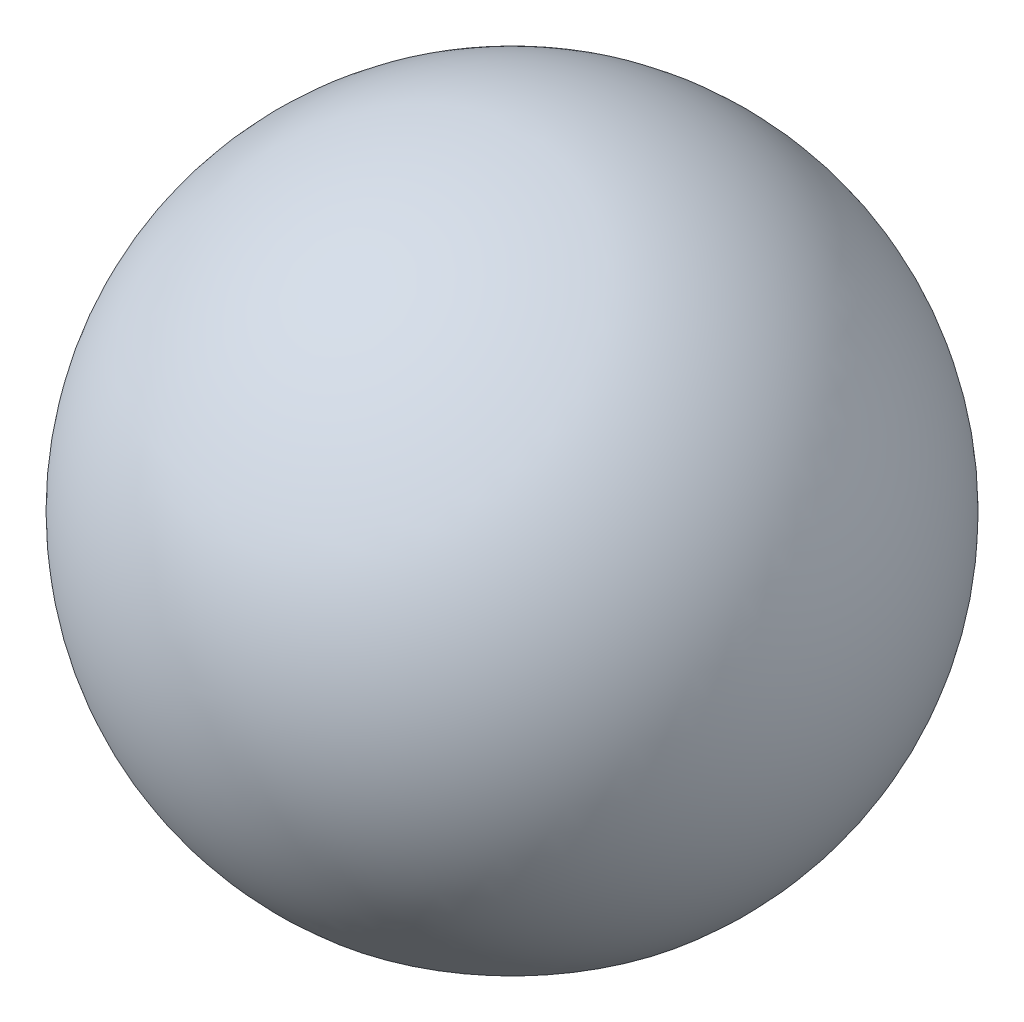
ISO-10303-21;
HEADER;
FILE_DESCRIPTION(('STEP AP214'),'2;1');
FILE_NAME('part.step','',(''),(''),'','','');
FILE_SCHEMA(('AUTOMOTIVE_DESIGN { 1 0 10303 214 1 1 1 1 }'));
ENDSEC;
DATA;
#1=APPLICATION_CONTEXT('core data for automotive mechanical design processes');
#2=APPLICATION_PROTOCOL_DEFINITION('international standard','automotive_design',2000,#1);
#3=PRODUCT_CONTEXT('',#1,'mechanical');
#4=PRODUCT('Part','Part','',(#3));
#5=PRODUCT_RELATED_PRODUCT_CATEGORY('part','',(#4));
#6=PRODUCT_DEFINITION_FORMATION('','',#4);
#7=PRODUCT_DEFINITION_CONTEXT('part definition',#1,'design');
#8=PRODUCT_DEFINITION('design','',#6,#7);
#9=PRODUCT_DEFINITION_SHAPE('','',#8);
#10=(LENGTH_UNIT() NAMED_UNIT(*) SI_UNIT(.MILLI.,.METRE.));
#11=(NAMED_UNIT(*) PLANE_ANGLE_UNIT() SI_UNIT($,.RADIAN.));
#12=(NAMED_UNIT(*) SI_UNIT($,.STERADIAN.) SOLID_ANGLE_UNIT());
#13=UNCERTAINTY_MEASURE_WITH_UNIT(LENGTH_MEASURE(1.E-05),#10,'distance_accuracy_value','');
#14=(GEOMETRIC_REPRESENTATION_CONTEXT(3) GLOBAL_UNCERTAINTY_ASSIGNED_CONTEXT((#13)) GLOBAL_UNIT_ASSIGNED_CONTEXT((#10,
#11,#12)) REPRESENTATION_CONTEXT('',''));
#15=CARTESIAN_POINT('',(0.,0.,0.));
#16=DIRECTION('',(0.,0.,1.));
#17=DIRECTION('',(1.,0.,0.));
#18=AXIS2_PLACEMENT_3D('',#15,#16,#17);
#19=CARTESIAN_POINT('',(-5.2,10.,0.));
#20=DIRECTION('',(-1.,0.,0.));
#21=DIRECTION('',(0.,0.,1.));
#22=AXIS2_PLACEMENT_3D('',#19,#20,#21);
#23=PLANE('',#22);
#24=DIRECTION('',(0.,-1.,0.));
#25=VECTOR('',#24,1.);
#26=CARTESIAN_POINT('',(-5.2,10.,3.95));
#27=LINE('',#26,#25);
#28=CARTESIAN_POINT('',(-5.2,10.,3.95));
#29=VERTEX_POINT('',#28);
#30=CARTESIAN_POINT('',(-5.2,3.,3.95));
#31=VERTEX_POINT('',#30);
#32=EDGE_CURVE('E50',#29,#31,#27,.T.);
#33=ORIENTED_EDGE('',*,*,#32,.T.);
#34=DIRECTION('',(0.,0.,-1.));
#35=VECTOR('',#34,1.);
#36=CARTESIAN_POINT('',(-5.2,3.,0.));
#37=LINE('',#36,#35);
#38=CARTESIAN_POINT('',(-5.2,3.,-3.95));
#39=VERTEX_POINT('',#38);
#40=EDGE_CURVE('E82',#31,#39,#37,.T.);
#41=ORIENTED_EDGE('',*,*,#40,.T.);
#42=DIRECTION('',(0.,-1.,0.));
#43=VECTOR('',#42,1.);
#44=CARTESIAN_POINT('',(-5.2,10.,-3.95));
#45=LINE('',#44,#43);
#46=CARTESIAN_POINT('',(-5.2,10.,-3.95));
#47=VERTEX_POINT('',#46);
#48=EDGE_CURVE('E64',#47,#39,#45,.T.);
#49=ORIENTED_EDGE('',*,*,#48,.F.);
#50=DIRECTION('',(0.,0.,-1.));
#51=VECTOR('',#50,1.);
#52=CARTESIAN_POINT('',(-5.2,10.,0.));
#53=LINE('',#52,#51);
#54=EDGE_CURVE('E122',#29,#47,#53,.T.);
#55=ORIENTED_EDGE('',*,*,#54,.F.);
#56=EDGE_LOOP('',(#33,#41,#49,#55));
#57=FACE_BOUND('',#56,.T.);
#58=ADVANCED_FACE('F41',(#57),#23,.F.);
#59=CARTESIAN_POINT('',(0.,10.,3.95));
#60=DIRECTION('',(0.,0.,-1.));
#61=DIRECTION('',(-1.,0.,0.));
#62=AXIS2_PLACEMENT_3D('',#59,#60,#61);
#63=PLANE('',#62);
#64=DIRECTION('',(1.,0.,0.));
#65=VECTOR('',#64,1.);
#66=CARTESIAN_POINT('',(0.,3.,3.95));
#67=LINE('',#66,#65);
#68=CARTESIAN_POINT('',(5.2,3.,3.95));
#69=VERTEX_POINT('',#68);
#70=EDGE_CURVE('E90',#31,#69,#67,.T.);
#71=ORIENTED_EDGE('',*,*,#70,.F.);
#72=ORIENTED_EDGE('',*,*,#32,.F.);
#73=DIRECTION('',(1.,0.,0.));
#74=VECTOR('',#73,1.);
#75=CARTESIAN_POINT('',(0.,10.,3.95));
#76=LINE('',#75,#74);
#77=CARTESIAN_POINT('',(5.2,10.,3.95));
#78=VERTEX_POINT('',#77);
#79=EDGE_CURVE('E114',#29,#78,#76,.T.);
#80=ORIENTED_EDGE('',*,*,#79,.T.);
#81=DIRECTION('',(0.,-1.,0.));
#82=VECTOR('',#81,1.);
#83=CARTESIAN_POINT('',(5.2,10.,3.95));
#84=LINE('',#83,#82);
#85=EDGE_CURVE('E101',#78,#69,#84,.T.);
#86=ORIENTED_EDGE('',*,*,#85,.T.);
#87=EDGE_LOOP('',(#71,#72,#80,#86));
#88=FACE_BOUND('',#87,.T.);
#89=ADVANCED_FACE('F112',(#88),#63,.T.);
#90=CARTESIAN_POINT('',(5.2,10.,0.));
#91=DIRECTION('',(-1.,0.,0.));
#92=DIRECTION('',(0.,0.,1.));
#93=AXIS2_PLACEMENT_3D('',#90,#91,#92);
#94=PLANE('',#93);
#95=DIRECTION('',(0.,0.,-1.));
#96=VECTOR('',#95,1.);
#97=CARTESIAN_POINT('',(5.2,3.,0.));
#98=LINE('',#97,#96);
#99=CARTESIAN_POINT('',(5.2,3.,-3.95));
#100=VERTEX_POINT('',#99);
#101=EDGE_CURVE('E57',#69,#100,#98,.T.);
#102=ORIENTED_EDGE('',*,*,#101,.F.);
#103=ORIENTED_EDGE('',*,*,#85,.F.);
#104=DIRECTION('',(0.,0.,-1.));
#105=VECTOR('',#104,1.);
#106=CARTESIAN_POINT('',(5.2,10.,0.));
#107=LINE('',#106,#105);
#108=CARTESIAN_POINT('',(5.2,10.,-3.95));
#109=VERTEX_POINT('',#108);
#110=EDGE_CURVE('E103',#78,#109,#107,.T.);
#111=ORIENTED_EDGE('',*,*,#110,.T.);
#112=DIRECTION('',(0.,-1.,0.));
#113=VECTOR('',#112,1.);
#114=CARTESIAN_POINT('',(5.2,10.,-3.95));
#115=LINE('',#114,#113);
#116=EDGE_CURVE('E97',#109,#100,#115,.T.);
#117=ORIENTED_EDGE('',*,*,#116,.T.);
#118=EDGE_LOOP('',(#102,#103,#111,#117));
#119=FACE_BOUND('',#118,.T.);
#120=ADVANCED_FACE('F117',(#119),#94,.T.);
#121=CARTESIAN_POINT('',(0.,10.,-3.95));
#122=DIRECTION('',(0.,0.,-1.));
#123=DIRECTION('',(-1.,0.,0.));
#124=AXIS2_PLACEMENT_3D('',#121,#122,#123);
#125=PLANE('',#124);
#126=ORIENTED_EDGE('',*,*,#48,.T.);
#127=DIRECTION('',(1.,0.,0.));
#128=VECTOR('',#127,1.);
#129=CARTESIAN_POINT('',(0.,3.,-3.95));
#130=LINE('',#129,#128);
#131=EDGE_CURVE('E11',#39,#100,#130,.T.);
#132=ORIENTED_EDGE('',*,*,#131,.T.);
#133=ORIENTED_EDGE('',*,*,#116,.F.);
#134=DIRECTION('',(1.,0.,0.));
#135=VECTOR('',#134,1.);
#136=CARTESIAN_POINT('',(0.,10.,-3.95));
#137=LINE('',#136,#135);
#138=EDGE_CURVE('E95',#47,#109,#137,.T.);
#139=ORIENTED_EDGE('',*,*,#138,.F.);
#140=EDGE_LOOP('',(#126,#132,#133,#139));
#141=FACE_BOUND('',#140,.T.);
#142=ADVANCED_FACE('F93',(#141),#125,.F.);
#143=CARTESIAN_POINT('',(0.,10.,0.));
#144=DIRECTION('',(0.,1.,0.));
#145=DIRECTION('',(0.,0.,1.));
#146=AXIS2_PLACEMENT_3D('',#143,#144,#145);
#147=PLANE('',#146);
#148=ORIENTED_EDGE('',*,*,#54,.T.);
#149=ORIENTED_EDGE('',*,*,#138,.T.);
#150=ORIENTED_EDGE('',*,*,#110,.F.);
#151=ORIENTED_EDGE('',*,*,#79,.F.);
#152=EDGE_LOOP('',(#148,#149,#150,#151));
#153=FACE_BOUND('',#152,.T.);
#154=ADVANCED_FACE('F119',(#153),#147,.F.);
#155=CARTESIAN_POINT('',(0.,3.,0.));
#156=DIRECTION('',(0.,1.,0.));
#157=DIRECTION('',(0.,0.,1.));
#158=AXIS2_PLACEMENT_3D('',#155,#156,#157);
#159=PLANE('',#158);
#160=CARTESIAN_POINT('',(0.,3.,0.));
#161=DIRECTION('',(0.,1.,0.));
#162=DIRECTION('',(0.,0.,1.));
#163=AXIS2_PLACEMENT_3D('',#160,#161,#162);
#164=CIRCLE('',#163,8.12403840463596);
#165=CARTESIAN_POINT('',(0.,3.,8.12403840463596));
#166=VERTEX_POINT('',#165);
#167=EDGE_CURVE('E89',#166,#166,#164,.F.);
#168=ORIENTED_EDGE('',*,*,#167,.T.);
#169=EDGE_LOOP('',(#168));
#170=FACE_BOUND('',#169,.T.);
#171=ORIENTED_EDGE('',*,*,#70,.T.);
#172=ORIENTED_EDGE('',*,*,#101,.T.);
#173=ORIENTED_EDGE('',*,*,#131,.F.);
#174=ORIENTED_EDGE('',*,*,#40,.F.);
#175=EDGE_LOOP('',(#171,#172,#173,#174));
#176=FACE_BOUND('',#175,.T.);
#177=ADVANCED_FACE('F81',(#170,#176),#159,.F.);
#178=CARTESIAN_POINT('',(0.,12.5,0.));
#179=DIRECTION('',(0.,-1.,0.));
#180=DIRECTION('',(0.,0.,1.));
#181=AXIS2_PLACEMENT_3D('',#178,#179,#180);
#182=SPHERICAL_SURFACE('',#181,12.5);
#183=ORIENTED_EDGE('',*,*,#167,.F.);
#184=EDGE_LOOP('',(#183));
#185=FACE_BOUND('',#184,.T.);
#186=ADVANCED_FACE('F43',(#185),#182,.T.);
#187=CLOSED_SHELL('',(#58,#89,#120,#142,#154,#177,#186));
#188=MANIFOLD_SOLID_BREP('B2',#187);
#189=ADVANCED_BREP_SHAPE_REPRESENTATION('',(#18,#188),#14);
#190=SHAPE_DEFINITION_REPRESENTATION(#9,#189);
ENDSEC;
END-ISO-10303-21;
